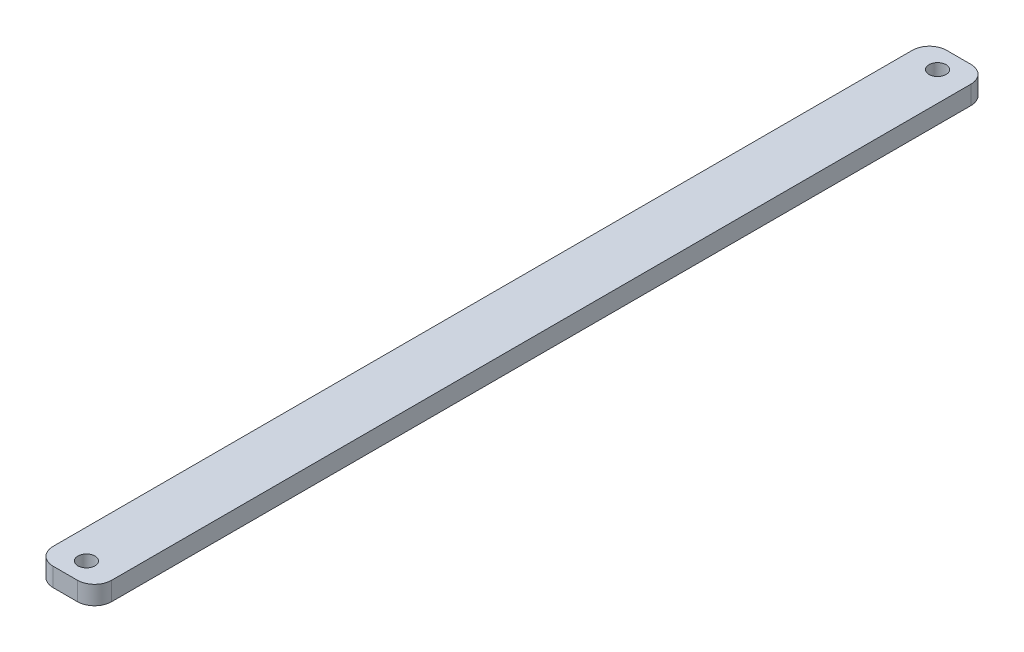
ISO-10303-21;
HEADER;
FILE_DESCRIPTION(('STEP AP214'),'2;1');
FILE_NAME('part.step','',(''),(''),'','','');
FILE_SCHEMA(('AUTOMOTIVE_DESIGN { 1 0 10303 214 1 1 1 1 }'));
ENDSEC;
DATA;
#1=APPLICATION_CONTEXT('core data for automotive mechanical design processes');
#2=APPLICATION_PROTOCOL_DEFINITION('international standard','automotive_design',2000,#1);
#3=PRODUCT_CONTEXT('',#1,'mechanical');
#4=PRODUCT('Part','Part','',(#3));
#5=PRODUCT_RELATED_PRODUCT_CATEGORY('part','',(#4));
#6=PRODUCT_DEFINITION_FORMATION('','',#4);
#7=PRODUCT_DEFINITION_CONTEXT('part definition',#1,'design');
#8=PRODUCT_DEFINITION('design','',#6,#7);
#9=PRODUCT_DEFINITION_SHAPE('','',#8);
#10=(LENGTH_UNIT() NAMED_UNIT(*) SI_UNIT(.MILLI.,.METRE.));
#11=(NAMED_UNIT(*) PLANE_ANGLE_UNIT() SI_UNIT($,.RADIAN.));
#12=(NAMED_UNIT(*) SI_UNIT($,.STERADIAN.) SOLID_ANGLE_UNIT());
#13=UNCERTAINTY_MEASURE_WITH_UNIT(LENGTH_MEASURE(1.E-05),#10,'distance_accuracy_value','');
#14=(GEOMETRIC_REPRESENTATION_CONTEXT(3) GLOBAL_UNCERTAINTY_ASSIGNED_CONTEXT((#13)) GLOBAL_UNIT_ASSIGNED_CONTEXT((#10,
#11,#12)) REPRESENTATION_CONTEXT('',''));
#15=CARTESIAN_POINT('',(0.,0.,0.));
#16=DIRECTION('',(0.,0.,1.));
#17=DIRECTION('',(1.,0.,0.));
#18=AXIS2_PLACEMENT_3D('',#15,#16,#17);
#19=CARTESIAN_POINT('',(0.,3.175,0.));
#20=DIRECTION('',(0.,1.,0.));
#21=DIRECTION('',(0.,0.,1.));
#22=AXIS2_PLACEMENT_3D('',#19,#20,#21);
#23=PLANE('',#22);
#24=CARTESIAN_POINT('',(0.,3.175,-72.58));
#25=DIRECTION('',(0.,1.,0.));
#26=DIRECTION('',(0.,0.,1.));
#27=AXIS2_PLACEMENT_3D('',#24,#25,#26);
#28=CIRCLE('',#27,1.4605);
#29=CARTESIAN_POINT('',(0.,3.175,-71.1195));
#30=VERTEX_POINT('',#29);
#31=EDGE_CURVE('E178',#30,#30,#28,.T.);
#32=ORIENTED_EDGE('',*,*,#31,.F.);
#33=EDGE_LOOP('',(#32));
#34=FACE_BOUND('',#33,.T.);
#35=DIRECTION('',(-1.,0.,0.));
#36=VECTOR('',#35,1.);
#37=CARTESIAN_POINT('',(-5.,3.175,-76.2000000000001));
#38=LINE('',#37,#36);
#39=CARTESIAN_POINT('',(2.079,3.175,-76.2000000000001));
#40=VERTEX_POINT('',#39);
#41=CARTESIAN_POINT('',(-2.079,3.175,-76.2000000000001));
#42=VERTEX_POINT('',#41);
#43=EDGE_CURVE('E172',#40,#42,#38,.T.);
#44=ORIENTED_EDGE('',*,*,#43,.T.);
#45=CARTESIAN_POINT('',(-2.079,3.175,-73.2790000000001));
#46=DIRECTION('',(0.,1.,0.));
#47=DIRECTION('',(0.,0.,1.));
#48=AXIS2_PLACEMENT_3D('',#45,#46,#47);
#49=CIRCLE('',#48,2.921);
#50=CARTESIAN_POINT('',(-5.,3.175,-73.2790000000001));
#51=VERTEX_POINT('',#50);
#52=EDGE_CURVE('E152',#42,#51,#49,.T.);
#53=ORIENTED_EDGE('',*,*,#52,.T.);
#54=DIRECTION('',(0.,0.,1.));
#55=VECTOR('',#54,1.);
#56=CARTESIAN_POINT('',(-5.,3.175,-76.2000000000001));
#57=LINE('',#56,#55);
#58=CARTESIAN_POINT('',(-4.99999999999999,3.175,73.2789999999999));
#59=VERTEX_POINT('',#58);
#60=EDGE_CURVE('E122',#51,#59,#57,.T.);
#61=ORIENTED_EDGE('',*,*,#60,.T.);
#62=CARTESIAN_POINT('',(-2.07899999999999,3.175,73.2789999999999));
#63=DIRECTION('',(0.,1.,0.));
#64=DIRECTION('',(0.,0.,1.));
#65=AXIS2_PLACEMENT_3D('',#62,#63,#64);
#66=CIRCLE('',#65,2.921);
#67=CARTESIAN_POINT('',(-2.07899999999999,3.175,76.1999999999999));
#68=VERTEX_POINT('',#67);
#69=EDGE_CURVE('E58',#59,#68,#66,.T.);
#70=ORIENTED_EDGE('',*,*,#69,.T.);
#71=DIRECTION('',(1.,0.,0.));
#72=VECTOR('',#71,1.);
#73=CARTESIAN_POINT('',(-4.99999999999999,3.175,76.1999999999999));
#74=LINE('',#73,#72);
#75=CARTESIAN_POINT('',(2.07900000000001,3.175,76.1999999999999));
#76=VERTEX_POINT('',#75);
#77=EDGE_CURVE('E139',#68,#76,#74,.T.);
#78=ORIENTED_EDGE('',*,*,#77,.T.);
#79=CARTESIAN_POINT('',(2.07900000000001,3.175,73.2789999999999));
#80=DIRECTION('',(0.,1.,0.));
#81=DIRECTION('',(0.,0.,1.));
#82=AXIS2_PLACEMENT_3D('',#79,#80,#81);
#83=CIRCLE('',#82,2.921);
#84=CARTESIAN_POINT('',(5.00000000000001,3.175,73.2789999999999));
#85=VERTEX_POINT('',#84);
#86=EDGE_CURVE('E147',#76,#85,#83,.T.);
#87=ORIENTED_EDGE('',*,*,#86,.T.);
#88=DIRECTION('',(0.,0.,-1.));
#89=VECTOR('',#88,1.);
#90=CARTESIAN_POINT('',(5.,3.175,-76.2000000000001));
#91=LINE('',#90,#89);
#92=CARTESIAN_POINT('',(5.,3.175,-73.2790000000001));
#93=VERTEX_POINT('',#92);
#94=EDGE_CURVE('E133',#85,#93,#91,.T.);
#95=ORIENTED_EDGE('',*,*,#94,.T.);
#96=CARTESIAN_POINT('',(2.079,3.175,-73.2790000000001));
#97=DIRECTION('',(0.,1.,0.));
#98=DIRECTION('',(0.,0.,1.));
#99=AXIS2_PLACEMENT_3D('',#96,#97,#98);
#100=CIRCLE('',#99,2.921);
#101=EDGE_CURVE('E150',#93,#40,#100,.T.);
#102=ORIENTED_EDGE('',*,*,#101,.T.);
#103=EDGE_LOOP('',(#44,#53,#61,#70,#78,#87,#95,#102));
#104=FACE_BOUND('',#103,.T.);
#105=CARTESIAN_POINT('',(0.,3.175,72.58));
#106=DIRECTION('',(0.,1.,0.));
#107=DIRECTION('',(0.,0.,1.));
#108=AXIS2_PLACEMENT_3D('',#105,#106,#107);
#109=CIRCLE('',#108,1.4605);
#110=CARTESIAN_POINT('',(0.,3.175,74.0405));
#111=VERTEX_POINT('',#110);
#112=EDGE_CURVE('E187',#111,#111,#109,.T.);
#113=ORIENTED_EDGE('',*,*,#112,.F.);
#114=EDGE_LOOP('',(#113));
#115=FACE_BOUND('',#114,.T.);
#116=ADVANCED_FACE('F37',(#34,#104,#115),#23,.T.);
#117=CARTESIAN_POINT('',(0.,0.,0.));
#118=DIRECTION('',(0.,1.,0.));
#119=DIRECTION('',(0.,0.,1.));
#120=AXIS2_PLACEMENT_3D('',#117,#118,#119);
#121=PLANE('',#120);
#122=DIRECTION('',(0.,0.,1.));
#123=VECTOR('',#122,1.);
#124=CARTESIAN_POINT('',(-5.,0.,-76.2000000000001));
#125=LINE('',#124,#123);
#126=CARTESIAN_POINT('',(-5.,0.,-73.2790000000001));
#127=VERTEX_POINT('',#126);
#128=CARTESIAN_POINT('',(-4.99999999999999,0.,73.2789999999999));
#129=VERTEX_POINT('',#128);
#130=EDGE_CURVE('E120',#127,#129,#125,.T.);
#131=ORIENTED_EDGE('',*,*,#130,.F.);
#132=CARTESIAN_POINT('',(-2.079,0.,-73.2790000000001));
#133=DIRECTION('',(0.,1.,0.));
#134=DIRECTION('',(0.,0.,1.));
#135=AXIS2_PLACEMENT_3D('',#132,#133,#134);
#136=CIRCLE('',#135,2.921);
#137=CARTESIAN_POINT('',(-2.079,0.,-76.2000000000001));
#138=VERTEX_POINT('',#137);
#139=EDGE_CURVE('E103',#127,#138,#136,.F.);
#140=ORIENTED_EDGE('',*,*,#139,.T.);
#141=DIRECTION('',(-1.,0.,0.));
#142=VECTOR('',#141,1.);
#143=CARTESIAN_POINT('',(-5.,0.,-76.2000000000001));
#144=LINE('',#143,#142);
#145=CARTESIAN_POINT('',(2.079,0.,-76.2000000000001));
#146=VERTEX_POINT('',#145);
#147=EDGE_CURVE('E131',#146,#138,#144,.T.);
#148=ORIENTED_EDGE('',*,*,#147,.F.);
#149=CARTESIAN_POINT('',(2.079,0.,-73.2790000000001));
#150=DIRECTION('',(0.,1.,0.));
#151=DIRECTION('',(0.,0.,1.));
#152=AXIS2_PLACEMENT_3D('',#149,#150,#151);
#153=CIRCLE('',#152,2.921);
#154=CARTESIAN_POINT('',(5.,0.,-73.2790000000001));
#155=VERTEX_POINT('',#154);
#156=EDGE_CURVE('E114',#146,#155,#153,.F.);
#157=ORIENTED_EDGE('',*,*,#156,.T.);
#158=DIRECTION('',(0.,0.,-1.));
#159=VECTOR('',#158,1.);
#160=CARTESIAN_POINT('',(5.,0.,-76.2000000000001));
#161=LINE('',#160,#159);
#162=CARTESIAN_POINT('',(5.00000000000001,0.,73.2789999999999));
#163=VERTEX_POINT('',#162);
#164=EDGE_CURVE('E135',#163,#155,#161,.T.);
#165=ORIENTED_EDGE('',*,*,#164,.F.);
#166=CARTESIAN_POINT('',(2.07900000000001,0.,73.2789999999999));
#167=DIRECTION('',(0.,1.,0.));
#168=DIRECTION('',(0.,0.,1.));
#169=AXIS2_PLACEMENT_3D('',#166,#167,#168);
#170=CIRCLE('',#169,2.921);
#171=CARTESIAN_POINT('',(2.07900000000001,0.,76.1999999999999));
#172=VERTEX_POINT('',#171);
#173=EDGE_CURVE('E123',#163,#172,#170,.F.);
#174=ORIENTED_EDGE('',*,*,#173,.T.);
#175=DIRECTION('',(1.,0.,0.));
#176=VECTOR('',#175,1.);
#177=CARTESIAN_POINT('',(-4.99999999999999,0.,76.1999999999999));
#178=LINE('',#177,#176);
#179=CARTESIAN_POINT('',(-2.07899999999999,0.,76.1999999999999));
#180=VERTEX_POINT('',#179);
#181=EDGE_CURVE('E130',#180,#172,#178,.T.);
#182=ORIENTED_EDGE('',*,*,#181,.F.);
#183=CARTESIAN_POINT('',(-2.07899999999999,0.,73.2789999999999));
#184=DIRECTION('',(0.,1.,0.));
#185=DIRECTION('',(0.,0.,1.));
#186=AXIS2_PLACEMENT_3D('',#183,#184,#185);
#187=CIRCLE('',#186,2.921);
#188=EDGE_CURVE('E129',#180,#129,#187,.F.);
#189=ORIENTED_EDGE('',*,*,#188,.T.);
#190=EDGE_LOOP('',(#131,#140,#148,#157,#165,#174,#182,#189));
#191=FACE_BOUND('',#190,.T.);
#192=CARTESIAN_POINT('',(0.,0.,-72.58));
#193=DIRECTION('',(0.,1.,0.));
#194=DIRECTION('',(0.,0.,1.));
#195=AXIS2_PLACEMENT_3D('',#192,#193,#194);
#196=CIRCLE('',#195,1.4605);
#197=CARTESIAN_POINT('',(0.,0.,-71.1195));
#198=VERTEX_POINT('',#197);
#199=EDGE_CURVE('E180',#198,#198,#196,.T.);
#200=ORIENTED_EDGE('',*,*,#199,.T.);
#201=EDGE_LOOP('',(#200));
#202=FACE_BOUND('',#201,.T.);
#203=CARTESIAN_POINT('',(0.,0.,72.58));
#204=DIRECTION('',(0.,1.,0.));
#205=DIRECTION('',(0.,0.,1.));
#206=AXIS2_PLACEMENT_3D('',#203,#204,#205);
#207=CIRCLE('',#206,1.4605);
#208=CARTESIAN_POINT('',(0.,0.,74.0405));
#209=VERTEX_POINT('',#208);
#210=EDGE_CURVE('E189',#209,#209,#207,.T.);
#211=ORIENTED_EDGE('',*,*,#210,.T.);
#212=EDGE_LOOP('',(#211));
#213=FACE_BOUND('',#212,.T.);
#214=ADVANCED_FACE('F126',(#191,#202,#213),#121,.F.);
#215=CARTESIAN_POINT('',(5.,3.175,-76.2000000000001));
#216=DIRECTION('',(-1.,0.,0.));
#217=DIRECTION('',(0.,0.,1.));
#218=AXIS2_PLACEMENT_3D('',#215,#216,#217);
#219=PLANE('',#218);
#220=ORIENTED_EDGE('',*,*,#164,.T.);
#221=DIRECTION('',(0.,-1.,0.));
#222=VECTOR('',#221,1.);
#223=CARTESIAN_POINT('',(5.,3.175,-73.2790000000001));
#224=LINE('',#223,#222);
#225=EDGE_CURVE('E157',#155,#93,#224,.F.);
#226=ORIENTED_EDGE('',*,*,#225,.T.);
#227=ORIENTED_EDGE('',*,*,#94,.F.);
#228=DIRECTION('',(0.,-1.,0.));
#229=VECTOR('',#228,1.);
#230=CARTESIAN_POINT('',(5.00000000000001,3.175,73.2789999999999));
#231=LINE('',#230,#229);
#232=EDGE_CURVE('E154',#85,#163,#231,.T.);
#233=ORIENTED_EDGE('',*,*,#232,.T.);
#234=EDGE_LOOP('',(#220,#226,#227,#233));
#235=FACE_BOUND('',#234,.T.);
#236=ADVANCED_FACE('F163',(#235),#219,.F.);
#237=CARTESIAN_POINT('',(-5.,3.175,-76.2000000000001));
#238=DIRECTION('',(0.,0.,1.));
#239=DIRECTION('',(1.,0.,0.));
#240=AXIS2_PLACEMENT_3D('',#237,#238,#239);
#241=PLANE('',#240);
#242=ORIENTED_EDGE('',*,*,#147,.T.);
#243=DIRECTION('',(0.,-1.,0.));
#244=VECTOR('',#243,1.);
#245=CARTESIAN_POINT('',(-2.079,3.175,-76.2000000000001));
#246=LINE('',#245,#244);
#247=EDGE_CURVE('E108',#138,#42,#246,.F.);
#248=ORIENTED_EDGE('',*,*,#247,.T.);
#249=ORIENTED_EDGE('',*,*,#43,.F.);
#250=DIRECTION('',(0.,-1.,0.));
#251=VECTOR('',#250,1.);
#252=CARTESIAN_POINT('',(2.079,3.175,-76.2000000000001));
#253=LINE('',#252,#251);
#254=EDGE_CURVE('E113',#40,#146,#253,.T.);
#255=ORIENTED_EDGE('',*,*,#254,.T.);
#256=EDGE_LOOP('',(#242,#248,#249,#255));
#257=FACE_BOUND('',#256,.T.);
#258=ADVANCED_FACE('F177',(#257),#241,.F.);
#259=CARTESIAN_POINT('',(-5.,3.175,-76.2000000000001));
#260=DIRECTION('',(1.,0.,0.));
#261=DIRECTION('',(0.,0.,-1.));
#262=AXIS2_PLACEMENT_3D('',#259,#260,#261);
#263=PLANE('',#262);
#264=ORIENTED_EDGE('',*,*,#60,.F.);
#265=DIRECTION('',(0.,-1.,0.));
#266=VECTOR('',#265,1.);
#267=CARTESIAN_POINT('',(-5.,3.175,-73.2790000000001));
#268=LINE('',#267,#266);
#269=EDGE_CURVE('E107',#51,#127,#268,.T.);
#270=ORIENTED_EDGE('',*,*,#269,.T.);
#271=ORIENTED_EDGE('',*,*,#130,.T.);
#272=DIRECTION('',(0.,-1.,0.));
#273=VECTOR('',#272,1.);
#274=CARTESIAN_POINT('',(-4.99999999999999,3.175,73.2789999999999));
#275=LINE('',#274,#273);
#276=EDGE_CURVE('E124',#129,#59,#275,.F.);
#277=ORIENTED_EDGE('',*,*,#276,.T.);
#278=EDGE_LOOP('',(#264,#270,#271,#277));
#279=FACE_BOUND('',#278,.T.);
#280=ADVANCED_FACE('F119',(#279),#263,.F.);
#281=CARTESIAN_POINT('',(-4.99999999999999,3.175,76.1999999999999));
#282=DIRECTION('',(0.,0.,-1.));
#283=DIRECTION('',(-1.,0.,0.));
#284=AXIS2_PLACEMENT_3D('',#281,#282,#283);
#285=PLANE('',#284);
#286=ORIENTED_EDGE('',*,*,#77,.F.);
#287=DIRECTION('',(0.,-1.,0.));
#288=VECTOR('',#287,1.);
#289=CARTESIAN_POINT('',(-2.07899999999999,3.175,76.1999999999999));
#290=LINE('',#289,#288);
#291=EDGE_CURVE('E11',#68,#180,#290,.T.);
#292=ORIENTED_EDGE('',*,*,#291,.T.);
#293=ORIENTED_EDGE('',*,*,#181,.T.);
#294=DIRECTION('',(0.,-1.,0.));
#295=VECTOR('',#294,1.);
#296=CARTESIAN_POINT('',(2.07900000000001,3.175,76.1999999999999));
#297=LINE('',#296,#295);
#298=EDGE_CURVE('E45',#172,#76,#297,.F.);
#299=ORIENTED_EDGE('',*,*,#298,.T.);
#300=EDGE_LOOP('',(#286,#292,#293,#299));
#301=FACE_BOUND('',#300,.T.);
#302=ADVANCED_FACE('F209',(#301),#285,.F.);
#303=CARTESIAN_POINT('',(0.,3.175,-72.58));
#304=DIRECTION('',(0.,-1.,0.));
#305=DIRECTION('',(0.,0.,-1.));
#306=AXIS2_PLACEMENT_3D('',#303,#304,#305);
#307=CYLINDRICAL_SURFACE('',#306,1.4605);
#308=ORIENTED_EDGE('',*,*,#31,.T.);
#309=EDGE_LOOP('',(#308));
#310=FACE_BOUND('',#309,.T.);
#311=ORIENTED_EDGE('',*,*,#199,.F.);
#312=EDGE_LOOP('',(#311));
#313=FACE_BOUND('',#312,.T.);
#314=ADVANCED_FACE('F206',(#310,#313),#307,.F.);
#315=CARTESIAN_POINT('',(0.,3.175,72.58));
#316=DIRECTION('',(0.,-1.,0.));
#317=DIRECTION('',(0.,0.,-1.));
#318=AXIS2_PLACEMENT_3D('',#315,#316,#317);
#319=CYLINDRICAL_SURFACE('',#318,1.4605);
#320=ORIENTED_EDGE('',*,*,#112,.T.);
#321=EDGE_LOOP('',(#320));
#322=FACE_BOUND('',#321,.T.);
#323=ORIENTED_EDGE('',*,*,#210,.F.);
#324=EDGE_LOOP('',(#323));
#325=FACE_BOUND('',#324,.T.);
#326=ADVANCED_FACE('F195',(#322,#325),#319,.F.);
#327=CARTESIAN_POINT('',(-2.079,3.175,-73.2790000000001));
#328=DIRECTION('',(0.,-1.,0.));
#329=DIRECTION('',(0.,0.,-1.));
#330=AXIS2_PLACEMENT_3D('',#327,#328,#329);
#331=CYLINDRICAL_SURFACE('',#330,2.921);
#332=ORIENTED_EDGE('',*,*,#52,.F.);
#333=ORIENTED_EDGE('',*,*,#247,.F.);
#334=ORIENTED_EDGE('',*,*,#139,.F.);
#335=ORIENTED_EDGE('',*,*,#269,.F.);
#336=EDGE_LOOP('',(#332,#333,#334,#335));
#337=FACE_BOUND('',#336,.T.);
#338=ADVANCED_FACE('F106',(#337),#331,.T.);
#339=CARTESIAN_POINT('',(2.079,3.175,-73.2790000000001));
#340=DIRECTION('',(0.,-1.,0.));
#341=DIRECTION('',(0.,0.,-1.));
#342=AXIS2_PLACEMENT_3D('',#339,#340,#341);
#343=CYLINDRICAL_SURFACE('',#342,2.921);
#344=ORIENTED_EDGE('',*,*,#101,.F.);
#345=ORIENTED_EDGE('',*,*,#225,.F.);
#346=ORIENTED_EDGE('',*,*,#156,.F.);
#347=ORIENTED_EDGE('',*,*,#254,.F.);
#348=EDGE_LOOP('',(#344,#345,#346,#347));
#349=FACE_BOUND('',#348,.T.);
#350=ADVANCED_FACE('F175',(#349),#343,.T.);
#351=CARTESIAN_POINT('',(-2.07899999999999,3.175,73.2789999999999));
#352=DIRECTION('',(0.,-1.,0.));
#353=DIRECTION('',(0.,0.,-1.));
#354=AXIS2_PLACEMENT_3D('',#351,#352,#353);
#355=CYLINDRICAL_SURFACE('',#354,2.921);
#356=ORIENTED_EDGE('',*,*,#69,.F.);
#357=ORIENTED_EDGE('',*,*,#276,.F.);
#358=ORIENTED_EDGE('',*,*,#188,.F.);
#359=ORIENTED_EDGE('',*,*,#291,.F.);
#360=EDGE_LOOP('',(#356,#357,#358,#359));
#361=FACE_BOUND('',#360,.T.);
#362=ADVANCED_FACE('F221',(#361),#355,.T.);
#363=CARTESIAN_POINT('',(2.07900000000001,3.175,73.2789999999999));
#364=DIRECTION('',(0.,-1.,0.));
#365=DIRECTION('',(0.,0.,-1.));
#366=AXIS2_PLACEMENT_3D('',#363,#364,#365);
#367=CYLINDRICAL_SURFACE('',#366,2.921);
#368=ORIENTED_EDGE('',*,*,#86,.F.);
#369=ORIENTED_EDGE('',*,*,#298,.F.);
#370=ORIENTED_EDGE('',*,*,#173,.F.);
#371=ORIENTED_EDGE('',*,*,#232,.F.);
#372=EDGE_LOOP('',(#368,#369,#370,#371));
#373=FACE_BOUND('',#372,.T.);
#374=ADVANCED_FACE('F39',(#373),#367,.T.);
#375=CLOSED_SHELL('',(#116,#214,#236,#258,#280,#302,#314,#326,#338,#350,#362,#374));
#376=MANIFOLD_SOLID_BREP('B2',#375);
#377=ADVANCED_BREP_SHAPE_REPRESENTATION('',(#18,#376),#14);
#378=SHAPE_DEFINITION_REPRESENTATION(#9,#377);
ENDSEC;
END-ISO-10303-21;
